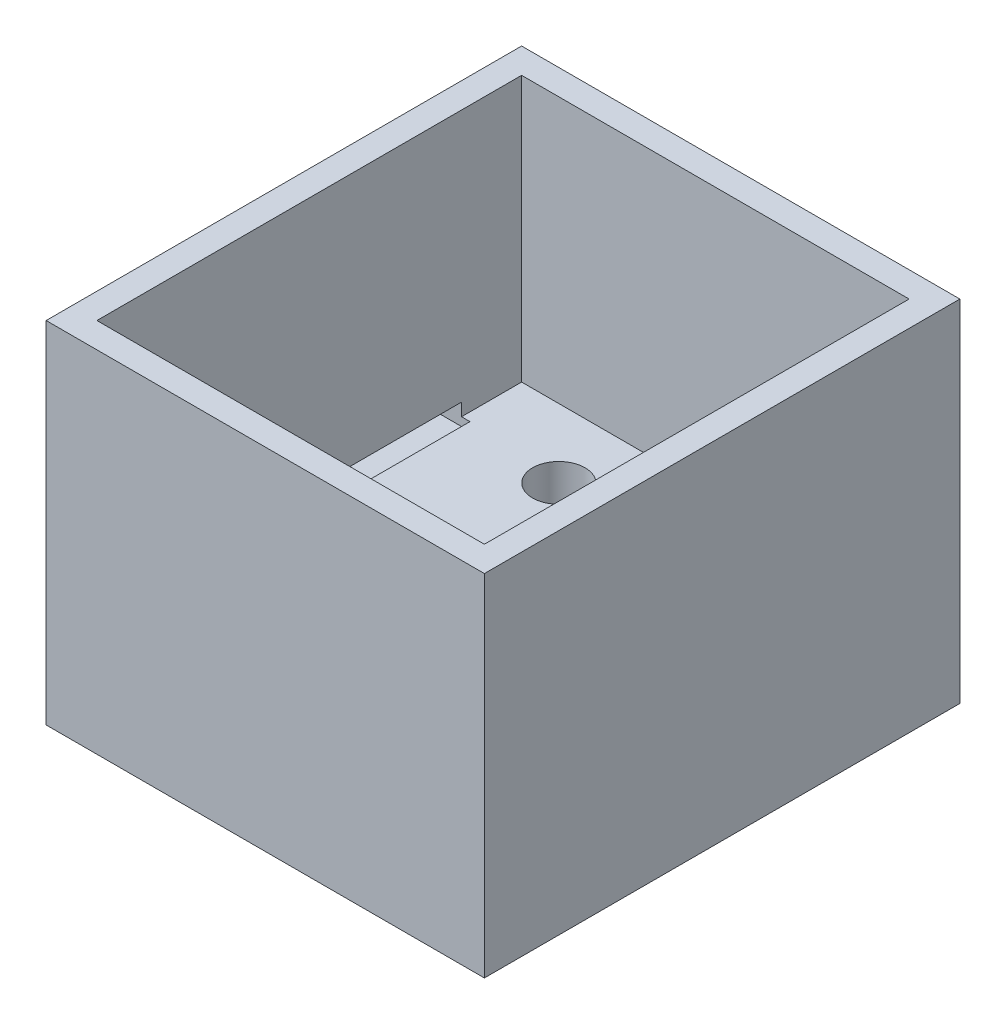
ISO-10303-21;
HEADER;
FILE_DESCRIPTION(('STEP AP214'),'2;1');
FILE_NAME('part.step','',(''),(''),'','','');
FILE_SCHEMA(('AUTOMOTIVE_DESIGN { 1 0 10303 214 1 1 1 1 }'));
ENDSEC;
DATA;
#1=APPLICATION_CONTEXT('core data for automotive mechanical design processes');
#2=APPLICATION_PROTOCOL_DEFINITION('international standard','automotive_design',2000,#1);
#3=PRODUCT_CONTEXT('',#1,'mechanical');
#4=PRODUCT('Part','Part','',(#3));
#5=PRODUCT_RELATED_PRODUCT_CATEGORY('part','',(#4));
#6=PRODUCT_DEFINITION_FORMATION('','',#4);
#7=PRODUCT_DEFINITION_CONTEXT('part definition',#1,'design');
#8=PRODUCT_DEFINITION('design','',#6,#7);
#9=PRODUCT_DEFINITION_SHAPE('','',#8);
#10=(LENGTH_UNIT() NAMED_UNIT(*) SI_UNIT(.MILLI.,.METRE.));
#11=(NAMED_UNIT(*) PLANE_ANGLE_UNIT() SI_UNIT($,.RADIAN.));
#12=(NAMED_UNIT(*) SI_UNIT($,.STERADIAN.) SOLID_ANGLE_UNIT());
#13=UNCERTAINTY_MEASURE_WITH_UNIT(LENGTH_MEASURE(1.E-05),#10,'distance_accuracy_value','');
#14=(GEOMETRIC_REPRESENTATION_CONTEXT(3) GLOBAL_UNCERTAINTY_ASSIGNED_CONTEXT((#13)) GLOBAL_UNIT_ASSIGNED_CONTEXT((#10,
#11,#12)) REPRESENTATION_CONTEXT('',''));
#15=CARTESIAN_POINT('',(0.,0.,0.));
#16=DIRECTION('',(0.,0.,1.));
#17=DIRECTION('',(1.,0.,0.));
#18=AXIS2_PLACEMENT_3D('',#15,#16,#17);
#19=CARTESIAN_POINT('',(0.,5.,0.));
#20=DIRECTION('',(0.,1.,0.));
#21=DIRECTION('',(0.,0.,1.));
#22=AXIS2_PLACEMENT_3D('',#19,#20,#21);
#23=PLANE('',#22);
#24=DIRECTION('',(-1.,0.,0.));
#25=VECTOR('',#24,1.);
#26=CARTESIAN_POINT('',(0.,5.,-20.05));
#27=LINE('',#26,#25);
#28=CARTESIAN_POINT('',(-1.,5.,-20.05));
#29=VERTEX_POINT('',#28);
#30=CARTESIAN_POINT('',(-1.5,5.,-20.05));
#31=VERTEX_POINT('',#30);
#32=EDGE_CURVE('E187',#29,#31,#27,.T.);
#33=ORIENTED_EDGE('',*,*,#32,.F.);
#34=DIRECTION('',(0.,0.,-1.));
#35=VECTOR('',#34,1.);
#36=CARTESIAN_POINT('',(-1.,5.,0.));
#37=LINE('',#36,#35);
#38=CARTESIAN_POINT('',(-1.,5.,-2.05));
#39=VERTEX_POINT('',#38);
#40=EDGE_CURVE('E11',#39,#29,#37,.T.);
#41=ORIENTED_EDGE('',*,*,#40,.F.);
#42=DIRECTION('',(1.,0.,0.));
#43=VECTOR('',#42,1.);
#44=CARTESIAN_POINT('',(0.,5.,-2.05));
#45=LINE('',#44,#43);
#46=CARTESIAN_POINT('',(-1.5,5.,-2.05));
#47=VERTEX_POINT('',#46);
#48=EDGE_CURVE('E152',#47,#39,#45,.T.);
#49=ORIENTED_EDGE('',*,*,#48,.F.);
#50=DIRECTION('',(0.,0.,1.));
#51=VECTOR('',#50,1.);
#52=CARTESIAN_POINT('',(-1.5,5.,1.5));
#53=LINE('',#52,#51);
#54=CARTESIAN_POINT('',(-1.5,5.,1.5));
#55=VERTEX_POINT('',#54);
#56=EDGE_CURVE('E190',#47,#55,#53,.T.);
#57=ORIENTED_EDGE('',*,*,#56,.T.);
#58=DIRECTION('',(1.,0.,0.));
#59=VECTOR('',#58,1.);
#60=CARTESIAN_POINT('',(21.4,5.,1.5));
#61=LINE('',#60,#59);
#62=CARTESIAN_POINT('',(21.4,5.,1.5));
#63=VERTEX_POINT('',#62);
#64=EDGE_CURVE('E210',#55,#63,#61,.T.);
#65=ORIENTED_EDGE('',*,*,#64,.T.);
#66=DIRECTION('',(0.,0.,-1.));
#67=VECTOR('',#66,1.);
#68=CARTESIAN_POINT('',(21.4,5.,-23.6));
#69=LINE('',#68,#67);
#70=CARTESIAN_POINT('',(21.4,5.,-23.6));
#71=VERTEX_POINT('',#70);
#72=EDGE_CURVE('E213',#63,#71,#69,.T.);
#73=ORIENTED_EDGE('',*,*,#72,.T.);
#74=DIRECTION('',(-1.,0.,0.));
#75=VECTOR('',#74,1.);
#76=CARTESIAN_POINT('',(-1.5,5.,-23.6));
#77=LINE('',#76,#75);
#78=CARTESIAN_POINT('',(-1.5,5.,-23.6));
#79=VERTEX_POINT('',#78);
#80=EDGE_CURVE('E195',#71,#79,#77,.T.);
#81=ORIENTED_EDGE('',*,*,#80,.T.);
#82=EDGE_CURVE('E206',#79,#31,#53,.T.);
#83=ORIENTED_EDGE('',*,*,#82,.T.);
#84=EDGE_LOOP('',(#33,#41,#49,#57,#65,#73,#81,#83));
#85=FACE_BOUND('',#84,.T.);
#86=CARTESIAN_POINT('',(17.36,5.,-2.54));
#87=DIRECTION('',(0.,1.,0.));
#88=DIRECTION('',(0.,0.,1.));
#89=AXIS2_PLACEMENT_3D('',#86,#87,#88);
#90=CIRCLE('',#89,1.55);
#91=CARTESIAN_POINT('',(17.36,5.,-0.990000000000002));
#92=VERTEX_POINT('',#91);
#93=EDGE_CURVE('E258',#92,#92,#90,.T.);
#94=ORIENTED_EDGE('',*,*,#93,.F.);
#95=EDGE_LOOP('',(#94));
#96=FACE_BOUND('',#95,.T.);
#97=CARTESIAN_POINT('',(4.76,5.,-19.54));
#98=DIRECTION('',(0.,1.,0.));
#99=DIRECTION('',(0.,0.,1.));
#100=AXIS2_PLACEMENT_3D('',#97,#98,#99);
#101=CIRCLE('',#100,1.55);
#102=CARTESIAN_POINT('',(4.76,5.,-17.99));
#103=VERTEX_POINT('',#102);
#104=EDGE_CURVE('E250',#103,#103,#101,.T.);
#105=ORIENTED_EDGE('',*,*,#104,.F.);
#106=EDGE_LOOP('',(#105));
#107=FACE_BOUND('',#106,.T.);
#108=ADVANCED_FACE('F39',(#85,#96,#107),#23,.T.);
#109=CARTESIAN_POINT('',(0.,0.,0.));
#110=DIRECTION('',(0.,1.,0.));
#111=DIRECTION('',(0.,0.,1.));
#112=AXIS2_PLACEMENT_3D('',#109,#110,#111);
#113=PLANE('',#112);
#114=DIRECTION('',(0.,0.,-1.));
#115=VECTOR('',#114,1.);
#116=CARTESIAN_POINT('',(22.9,0.,3.));
#117=LINE('',#116,#115);
#118=CARTESIAN_POINT('',(22.9,0.,3.));
#119=VERTEX_POINT('',#118);
#120=CARTESIAN_POINT('',(22.9,0.,-25.1));
#121=VERTEX_POINT('',#120);
#122=EDGE_CURVE('E262',#119,#121,#117,.T.);
#123=ORIENTED_EDGE('',*,*,#122,.F.);
#124=DIRECTION('',(1.,0.,0.));
#125=VECTOR('',#124,1.);
#126=CARTESIAN_POINT('',(-3.,0.,3.));
#127=LINE('',#126,#125);
#128=CARTESIAN_POINT('',(-3.,0.,3.));
#129=VERTEX_POINT('',#128);
#130=EDGE_CURVE('E275',#129,#119,#127,.T.);
#131=ORIENTED_EDGE('',*,*,#130,.F.);
#132=DIRECTION('',(0.,0.,1.));
#133=VECTOR('',#132,1.);
#134=CARTESIAN_POINT('',(-3.,0.,-25.1));
#135=LINE('',#134,#133);
#136=CARTESIAN_POINT('',(-3.,0.,-25.1));
#137=VERTEX_POINT('',#136);
#138=EDGE_CURVE('E272',#137,#129,#135,.T.);
#139=ORIENTED_EDGE('',*,*,#138,.F.);
#140=DIRECTION('',(-1.,0.,0.));
#141=VECTOR('',#140,1.);
#142=CARTESIAN_POINT('',(0.,0.,-25.1));
#143=LINE('',#142,#141);
#144=EDGE_CURVE('E269',#121,#137,#143,.T.);
#145=ORIENTED_EDGE('',*,*,#144,.F.);
#146=EDGE_LOOP('',(#123,#131,#139,#145));
#147=FACE_BOUND('',#146,.T.);
#148=CARTESIAN_POINT('',(17.36,0.,-2.54));
#149=DIRECTION('',(0.,1.,0.));
#150=DIRECTION('',(0.,0.,1.));
#151=AXIS2_PLACEMENT_3D('',#148,#149,#150);
#152=CIRCLE('',#151,1.55);
#153=CARTESIAN_POINT('',(17.36,0.,-0.990000000000002));
#154=VERTEX_POINT('',#153);
#155=EDGE_CURVE('E254',#154,#154,#152,.T.);
#156=ORIENTED_EDGE('',*,*,#155,.T.);
#157=EDGE_LOOP('',(#156));
#158=FACE_BOUND('',#157,.T.);
#159=CARTESIAN_POINT('',(4.76,0.,-19.54));
#160=DIRECTION('',(0.,1.,0.));
#161=DIRECTION('',(0.,0.,1.));
#162=AXIS2_PLACEMENT_3D('',#159,#160,#161);
#163=CIRCLE('',#162,1.55);
#164=CARTESIAN_POINT('',(4.76,0.,-17.99));
#165=VERTEX_POINT('',#164);
#166=EDGE_CURVE('E249',#165,#165,#163,.T.);
#167=ORIENTED_EDGE('',*,*,#166,.T.);
#168=EDGE_LOOP('',(#167));
#169=FACE_BOUND('',#168,.T.);
#170=ADVANCED_FACE('F332',(#147,#158,#169),#113,.F.);
#171=CARTESIAN_POINT('',(22.9,5.,3.));
#172=DIRECTION('',(-1.,0.,0.));
#173=DIRECTION('',(0.,0.,1.));
#174=AXIS2_PLACEMENT_3D('',#171,#172,#173);
#175=PLANE('',#174);
#176=ORIENTED_EDGE('',*,*,#122,.T.);
#177=DIRECTION('',(0.,-1.,0.));
#178=VECTOR('',#177,1.);
#179=CARTESIAN_POINT('',(22.9,5.,-25.1));
#180=LINE('',#179,#178);
#181=CARTESIAN_POINT('',(22.9,20.7,-25.1));
#182=VERTEX_POINT('',#181);
#183=EDGE_CURVE('E290',#182,#121,#180,.T.);
#184=ORIENTED_EDGE('',*,*,#183,.F.);
#185=DIRECTION('',(0.,0.,-1.));
#186=VECTOR('',#185,1.);
#187=CARTESIAN_POINT('',(22.9,20.7,3.));
#188=LINE('',#187,#186);
#189=CARTESIAN_POINT('',(22.9,20.7,3.));
#190=VERTEX_POINT('',#189);
#191=EDGE_CURVE('E245',#190,#182,#188,.T.);
#192=ORIENTED_EDGE('',*,*,#191,.F.);
#193=DIRECTION('',(0.,-1.,0.));
#194=VECTOR('',#193,1.);
#195=CARTESIAN_POINT('',(22.9,5.,3.));
#196=LINE('',#195,#194);
#197=EDGE_CURVE('E278',#190,#119,#196,.T.);
#198=ORIENTED_EDGE('',*,*,#197,.T.);
#199=EDGE_LOOP('',(#176,#184,#192,#198));
#200=FACE_BOUND('',#199,.T.);
#201=ADVANCED_FACE('F41',(#200),#175,.F.);
#202=CARTESIAN_POINT('',(0.,5.,-25.1));
#203=DIRECTION('',(0.,0.,1.));
#204=DIRECTION('',(1.,0.,0.));
#205=AXIS2_PLACEMENT_3D('',#202,#203,#204);
#206=PLANE('',#205);
#207=ORIENTED_EDGE('',*,*,#144,.T.);
#208=DIRECTION('',(0.,-1.,0.));
#209=VECTOR('',#208,1.);
#210=CARTESIAN_POINT('',(-3.,5.,-25.1));
#211=LINE('',#210,#209);
#212=CARTESIAN_POINT('',(-3.,20.7,-25.1));
#213=VERTEX_POINT('',#212);
#214=EDGE_CURVE('E286',#213,#137,#211,.T.);
#215=ORIENTED_EDGE('',*,*,#214,.F.);
#216=DIRECTION('',(-1.,0.,0.));
#217=VECTOR('',#216,1.);
#218=CARTESIAN_POINT('',(22.9,20.7,-25.1));
#219=LINE('',#218,#217);
#220=EDGE_CURVE('E233',#182,#213,#219,.T.);
#221=ORIENTED_EDGE('',*,*,#220,.F.);
#222=ORIENTED_EDGE('',*,*,#183,.T.);
#223=EDGE_LOOP('',(#207,#215,#221,#222));
#224=FACE_BOUND('',#223,.T.);
#225=ADVANCED_FACE('F323',(#224),#206,.F.);
#226=CARTESIAN_POINT('',(-3.,5.,-25.1));
#227=DIRECTION('',(1.,0.,0.));
#228=DIRECTION('',(0.,0.,-1.));
#229=AXIS2_PLACEMENT_3D('',#226,#227,#228);
#230=PLANE('',#229);
#231=DIRECTION('',(0.,1.,0.));
#232=VECTOR('',#231,1.);
#233=CARTESIAN_POINT('',(-3.,5.75,-2.05));
#234=LINE('',#233,#232);
#235=CARTESIAN_POINT('',(-3.,4.5,-2.05));
#236=VERTEX_POINT('',#235);
#237=CARTESIAN_POINT('',(-3.,5.75,-2.05));
#238=VERTEX_POINT('',#237);
#239=EDGE_CURVE('E167',#236,#238,#234,.T.);
#240=ORIENTED_EDGE('',*,*,#239,.F.);
#241=DIRECTION('',(0.,0.,1.));
#242=VECTOR('',#241,1.);
#243=CARTESIAN_POINT('',(-3.,4.5,-11.05));
#244=LINE('',#243,#242);
#245=CARTESIAN_POINT('',(-3.,4.5,-20.05));
#246=VERTEX_POINT('',#245);
#247=EDGE_CURVE('E143',#246,#236,#244,.T.);
#248=ORIENTED_EDGE('',*,*,#247,.F.);
#249=DIRECTION('',(0.,-1.,0.));
#250=VECTOR('',#249,1.);
#251=CARTESIAN_POINT('',(-3.,4.5,-20.05));
#252=LINE('',#251,#250);
#253=CARTESIAN_POINT('',(-3.,5.75,-20.05));
#254=VERTEX_POINT('',#253);
#255=EDGE_CURVE('E162',#254,#246,#252,.T.);
#256=ORIENTED_EDGE('',*,*,#255,.F.);
#257=DIRECTION('',(0.,0.,-1.));
#258=VECTOR('',#257,1.);
#259=CARTESIAN_POINT('',(-3.,5.75,-20.05));
#260=LINE('',#259,#258);
#261=EDGE_CURVE('E170',#238,#254,#260,.T.);
#262=ORIENTED_EDGE('',*,*,#261,.F.);
#263=EDGE_LOOP('',(#240,#248,#256,#262));
#264=FACE_BOUND('',#263,.T.);
#265=ORIENTED_EDGE('',*,*,#138,.T.);
#266=DIRECTION('',(0.,-1.,0.));
#267=VECTOR('',#266,1.);
#268=CARTESIAN_POINT('',(-3.,5.,3.));
#269=LINE('',#268,#267);
#270=CARTESIAN_POINT('',(-3.,20.7,3.));
#271=VERTEX_POINT('',#270);
#272=EDGE_CURVE('E282',#271,#129,#269,.T.);
#273=ORIENTED_EDGE('',*,*,#272,.F.);
#274=DIRECTION('',(0.,0.,1.));
#275=VECTOR('',#274,1.);
#276=CARTESIAN_POINT('',(-3.,20.7,-25.1));
#277=LINE('',#276,#275);
#278=EDGE_CURVE('E237',#213,#271,#277,.T.);
#279=ORIENTED_EDGE('',*,*,#278,.F.);
#280=ORIENTED_EDGE('',*,*,#214,.T.);
#281=EDGE_LOOP('',(#265,#273,#279,#280));
#282=FACE_BOUND('',#281,.T.);
#283=ADVANCED_FACE('F319',(#264,#282),#230,.F.);
#284=CARTESIAN_POINT('',(-3.,5.,3.));
#285=DIRECTION('',(0.,0.,-1.));
#286=DIRECTION('',(-1.,0.,0.));
#287=AXIS2_PLACEMENT_3D('',#284,#285,#286);
#288=PLANE('',#287);
#289=ORIENTED_EDGE('',*,*,#130,.T.);
#290=ORIENTED_EDGE('',*,*,#197,.F.);
#291=DIRECTION('',(1.,0.,0.));
#292=VECTOR('',#291,1.);
#293=CARTESIAN_POINT('',(-3.,20.7,3.));
#294=LINE('',#293,#292);
#295=EDGE_CURVE('E241',#271,#190,#294,.T.);
#296=ORIENTED_EDGE('',*,*,#295,.F.);
#297=ORIENTED_EDGE('',*,*,#272,.T.);
#298=EDGE_LOOP('',(#289,#290,#296,#297));
#299=FACE_BOUND('',#298,.T.);
#300=ADVANCED_FACE('F322',(#299),#288,.F.);
#301=CARTESIAN_POINT('',(17.36,5.,-2.54));
#302=DIRECTION('',(0.,-1.,0.));
#303=DIRECTION('',(0.,0.,-1.));
#304=AXIS2_PLACEMENT_3D('',#301,#302,#303);
#305=CYLINDRICAL_SURFACE('',#304,1.55);
#306=ORIENTED_EDGE('',*,*,#93,.T.);
#307=EDGE_LOOP('',(#306));
#308=FACE_BOUND('',#307,.T.);
#309=ORIENTED_EDGE('',*,*,#155,.F.);
#310=EDGE_LOOP('',(#309));
#311=FACE_BOUND('',#310,.T.);
#312=ADVANCED_FACE('F352',(#308,#311),#305,.F.);
#313=CARTESIAN_POINT('',(4.76,5.,-19.54));
#314=DIRECTION('',(0.,-1.,0.));
#315=DIRECTION('',(0.,0.,-1.));
#316=AXIS2_PLACEMENT_3D('',#313,#314,#315);
#317=CYLINDRICAL_SURFACE('',#316,1.55);
#318=ORIENTED_EDGE('',*,*,#104,.T.);
#319=EDGE_LOOP('',(#318));
#320=FACE_BOUND('',#319,.T.);
#321=ORIENTED_EDGE('',*,*,#166,.F.);
#322=EDGE_LOOP('',(#321));
#323=FACE_BOUND('',#322,.T.);
#324=ADVANCED_FACE('F359',(#320,#323),#317,.F.);
#325=CARTESIAN_POINT('',(0.,20.7,0.));
#326=DIRECTION('',(0.,1.,0.));
#327=DIRECTION('',(0.,0.,1.));
#328=AXIS2_PLACEMENT_3D('',#325,#326,#327);
#329=PLANE('',#328);
#330=ORIENTED_EDGE('',*,*,#220,.T.);
#331=ORIENTED_EDGE('',*,*,#278,.T.);
#332=ORIENTED_EDGE('',*,*,#295,.T.);
#333=ORIENTED_EDGE('',*,*,#191,.T.);
#334=EDGE_LOOP('',(#330,#331,#332,#333));
#335=FACE_BOUND('',#334,.T.);
#336=DIRECTION('',(1.,0.,0.));
#337=VECTOR('',#336,1.);
#338=CARTESIAN_POINT('',(21.4,20.7,1.5));
#339=LINE('',#338,#337);
#340=CARTESIAN_POINT('',(-1.5,20.7,1.5));
#341=VERTEX_POINT('',#340);
#342=CARTESIAN_POINT('',(21.4,20.7,1.5));
#343=VERTEX_POINT('',#342);
#344=EDGE_CURVE('E194',#341,#343,#339,.T.);
#345=ORIENTED_EDGE('',*,*,#344,.F.);
#346=DIRECTION('',(0.,0.,1.));
#347=VECTOR('',#346,1.);
#348=CARTESIAN_POINT('',(-1.5,20.7,1.5));
#349=LINE('',#348,#347);
#350=CARTESIAN_POINT('',(-1.5,20.7,-23.6));
#351=VERTEX_POINT('',#350);
#352=EDGE_CURVE('E191',#351,#341,#349,.T.);
#353=ORIENTED_EDGE('',*,*,#352,.F.);
#354=DIRECTION('',(-1.,0.,0.));
#355=VECTOR('',#354,1.);
#356=CARTESIAN_POINT('',(-1.5,20.7,-23.6));
#357=LINE('',#356,#355);
#358=CARTESIAN_POINT('',(21.4,20.7,-23.6));
#359=VERTEX_POINT('',#358);
#360=EDGE_CURVE('E202',#359,#351,#357,.T.);
#361=ORIENTED_EDGE('',*,*,#360,.F.);
#362=DIRECTION('',(0.,0.,-1.));
#363=VECTOR('',#362,1.);
#364=CARTESIAN_POINT('',(21.4,20.7,-23.6));
#365=LINE('',#364,#363);
#366=EDGE_CURVE('E198',#343,#359,#365,.T.);
#367=ORIENTED_EDGE('',*,*,#366,.F.);
#368=EDGE_LOOP('',(#345,#353,#361,#367));
#369=FACE_BOUND('',#368,.T.);
#370=ADVANCED_FACE('F337',(#335,#369),#329,.T.);
#371=CARTESIAN_POINT('',(-1.5,20.7,1.5));
#372=DIRECTION('',(1.,0.,0.));
#373=DIRECTION('',(0.,0.,-1.));
#374=AXIS2_PLACEMENT_3D('',#371,#372,#373);
#375=PLANE('',#374);
#376=DIRECTION('',(0.,1.,0.));
#377=VECTOR('',#376,1.);
#378=CARTESIAN_POINT('',(-1.5,20.7,-20.05));
#379=LINE('',#378,#377);
#380=CARTESIAN_POINT('',(-1.5,5.75,-20.05));
#381=VERTEX_POINT('',#380);
#382=EDGE_CURVE('E48',#31,#381,#379,.T.);
#383=ORIENTED_EDGE('',*,*,#382,.F.);
#384=ORIENTED_EDGE('',*,*,#82,.F.);
#385=DIRECTION('',(0.,-1.,0.));
#386=VECTOR('',#385,1.);
#387=CARTESIAN_POINT('',(-1.5,20.7,-23.6));
#388=LINE('',#387,#386);
#389=EDGE_CURVE('E205',#351,#79,#388,.T.);
#390=ORIENTED_EDGE('',*,*,#389,.F.);
#391=ORIENTED_EDGE('',*,*,#352,.T.);
#392=DIRECTION('',(0.,-1.,0.));
#393=VECTOR('',#392,1.);
#394=CARTESIAN_POINT('',(-1.5,20.7,1.5));
#395=LINE('',#394,#393);
#396=EDGE_CURVE('E229',#341,#55,#395,.T.);
#397=ORIENTED_EDGE('',*,*,#396,.T.);
#398=ORIENTED_EDGE('',*,*,#56,.F.);
#399=DIRECTION('',(0.,-1.,0.));
#400=VECTOR('',#399,1.);
#401=CARTESIAN_POINT('',(-1.5,20.7,-2.05));
#402=LINE('',#401,#400);
#403=CARTESIAN_POINT('',(-1.5,5.75,-2.05));
#404=VERTEX_POINT('',#403);
#405=EDGE_CURVE('E294',#404,#47,#402,.T.);
#406=ORIENTED_EDGE('',*,*,#405,.F.);
#407=DIRECTION('',(0.,0.,1.));
#408=VECTOR('',#407,1.);
#409=CARTESIAN_POINT('',(-1.5,5.75,1.5));
#410=LINE('',#409,#408);
#411=EDGE_CURVE('E297',#381,#404,#410,.T.);
#412=ORIENTED_EDGE('',*,*,#411,.F.);
#413=EDGE_LOOP('',(#383,#384,#390,#391,#397,#398,#406,#412));
#414=FACE_BOUND('',#413,.T.);
#415=ADVANCED_FACE('F313',(#414),#375,.T.);
#416=CARTESIAN_POINT('',(21.4,20.7,1.5));
#417=DIRECTION('',(0.,0.,-1.));
#418=DIRECTION('',(-1.,0.,0.));
#419=AXIS2_PLACEMENT_3D('',#416,#417,#418);
#420=PLANE('',#419);
#421=ORIENTED_EDGE('',*,*,#64,.F.);
#422=ORIENTED_EDGE('',*,*,#396,.F.);
#423=ORIENTED_EDGE('',*,*,#344,.T.);
#424=DIRECTION('',(0.,-1.,0.));
#425=VECTOR('',#424,1.);
#426=CARTESIAN_POINT('',(21.4,20.7,1.5));
#427=LINE('',#426,#425);
#428=EDGE_CURVE('E225',#343,#63,#427,.T.);
#429=ORIENTED_EDGE('',*,*,#428,.T.);
#430=EDGE_LOOP('',(#421,#422,#423,#429));
#431=FACE_BOUND('',#430,.T.);
#432=ADVANCED_FACE('F380',(#431),#420,.T.);
#433=CARTESIAN_POINT('',(21.4,20.7,-23.6));
#434=DIRECTION('',(-1.,0.,0.));
#435=DIRECTION('',(0.,0.,1.));
#436=AXIS2_PLACEMENT_3D('',#433,#434,#435);
#437=PLANE('',#436);
#438=ORIENTED_EDGE('',*,*,#72,.F.);
#439=ORIENTED_EDGE('',*,*,#428,.F.);
#440=ORIENTED_EDGE('',*,*,#366,.T.);
#441=DIRECTION('',(0.,-1.,0.));
#442=VECTOR('',#441,1.);
#443=CARTESIAN_POINT('',(21.4,20.7,-23.6));
#444=LINE('',#443,#442);
#445=EDGE_CURVE('E221',#359,#71,#444,.T.);
#446=ORIENTED_EDGE('',*,*,#445,.T.);
#447=EDGE_LOOP('',(#438,#439,#440,#446));
#448=FACE_BOUND('',#447,.T.);
#449=ADVANCED_FACE('F383',(#448),#437,.T.);
#450=CARTESIAN_POINT('',(-1.5,20.7,-23.6));
#451=DIRECTION('',(0.,0.,1.));
#452=DIRECTION('',(1.,0.,0.));
#453=AXIS2_PLACEMENT_3D('',#450,#451,#452);
#454=PLANE('',#453);
#455=ORIENTED_EDGE('',*,*,#80,.F.);
#456=ORIENTED_EDGE('',*,*,#445,.F.);
#457=ORIENTED_EDGE('',*,*,#360,.T.);
#458=ORIENTED_EDGE('',*,*,#389,.T.);
#459=EDGE_LOOP('',(#455,#456,#457,#458));
#460=FACE_BOUND('',#459,.T.);
#461=ADVANCED_FACE('F387',(#460),#454,.T.);
#462=CARTESIAN_POINT('',(-1.,4.5,-11.05));
#463=DIRECTION('',(0.,-1.,0.));
#464=DIRECTION('',(0.,0.,-1.));
#465=AXIS2_PLACEMENT_3D('',#462,#463,#464);
#466=PLANE('',#465);
#467=ORIENTED_EDGE('',*,*,#247,.T.);
#468=DIRECTION('',(-1.,0.,0.));
#469=VECTOR('',#468,1.);
#470=CARTESIAN_POINT('',(-1.,4.5,-2.05));
#471=LINE('',#470,#469);
#472=CARTESIAN_POINT('',(-1.,4.5,-2.05));
#473=VERTEX_POINT('',#472);
#474=EDGE_CURVE('E55',#473,#236,#471,.T.);
#475=ORIENTED_EDGE('',*,*,#474,.F.);
#476=DIRECTION('',(0.,0.,1.));
#477=VECTOR('',#476,1.);
#478=CARTESIAN_POINT('',(-1.,4.5,-11.05));
#479=LINE('',#478,#477);
#480=CARTESIAN_POINT('',(-1.,4.5,-20.05));
#481=VERTEX_POINT('',#480);
#482=EDGE_CURVE('E140',#481,#473,#479,.T.);
#483=ORIENTED_EDGE('',*,*,#482,.F.);
#484=DIRECTION('',(-1.,0.,0.));
#485=VECTOR('',#484,1.);
#486=CARTESIAN_POINT('',(-1.,4.5,-20.05));
#487=LINE('',#486,#485);
#488=EDGE_CURVE('E177',#481,#246,#487,.T.);
#489=ORIENTED_EDGE('',*,*,#488,.T.);
#490=EDGE_LOOP('',(#467,#475,#483,#489));
#491=FACE_BOUND('',#490,.T.);
#492=ADVANCED_FACE('F138',(#491),#466,.F.);
#493=CARTESIAN_POINT('',(-1.,4.5,-20.05));
#494=DIRECTION('',(0.,0.,-1.));
#495=DIRECTION('',(-1.,0.,0.));
#496=AXIS2_PLACEMENT_3D('',#493,#494,#495);
#497=PLANE('',#496);
#498=ORIENTED_EDGE('',*,*,#32,.T.);
#499=ORIENTED_EDGE('',*,*,#382,.T.);
#500=DIRECTION('',(-1.,0.,0.));
#501=VECTOR('',#500,1.);
#502=CARTESIAN_POINT('',(-1.,5.75,-20.05));
#503=LINE('',#502,#501);
#504=EDGE_CURVE('E180',#381,#254,#503,.T.);
#505=ORIENTED_EDGE('',*,*,#504,.T.);
#506=ORIENTED_EDGE('',*,*,#255,.T.);
#507=ORIENTED_EDGE('',*,*,#488,.F.);
#508=DIRECTION('',(0.,-1.,0.));
#509=VECTOR('',#508,1.);
#510=CARTESIAN_POINT('',(-1.,4.5,-20.05));
#511=LINE('',#510,#509);
#512=EDGE_CURVE('E146',#29,#481,#511,.T.);
#513=ORIENTED_EDGE('',*,*,#512,.F.);
#514=EDGE_LOOP('',(#498,#499,#505,#506,#507,#513));
#515=FACE_BOUND('',#514,.T.);
#516=ADVANCED_FACE('F303',(#515),#497,.F.);
#517=CARTESIAN_POINT('',(-1.,5.75,-20.05));
#518=DIRECTION('',(0.,1.,0.));
#519=DIRECTION('',(0.,0.,1.));
#520=AXIS2_PLACEMENT_3D('',#517,#518,#519);
#521=PLANE('',#520);
#522=ORIENTED_EDGE('',*,*,#411,.T.);
#523=DIRECTION('',(-1.,0.,0.));
#524=VECTOR('',#523,1.);
#525=CARTESIAN_POINT('',(-1.,5.75,-2.05));
#526=LINE('',#525,#524);
#527=EDGE_CURVE('E61',#404,#238,#526,.T.);
#528=ORIENTED_EDGE('',*,*,#527,.T.);
#529=ORIENTED_EDGE('',*,*,#261,.T.);
#530=ORIENTED_EDGE('',*,*,#504,.F.);
#531=EDGE_LOOP('',(#522,#528,#529,#530));
#532=FACE_BOUND('',#531,.T.);
#533=ADVANCED_FACE('F309',(#532),#521,.F.);
#534=CARTESIAN_POINT('',(-1.,5.75,-2.05));
#535=DIRECTION('',(0.,0.,1.));
#536=DIRECTION('',(1.,0.,0.));
#537=AXIS2_PLACEMENT_3D('',#534,#535,#536);
#538=PLANE('',#537);
#539=ORIENTED_EDGE('',*,*,#48,.T.);
#540=DIRECTION('',(0.,1.,0.));
#541=VECTOR('',#540,1.);
#542=CARTESIAN_POINT('',(-1.,5.75,-2.05));
#543=LINE('',#542,#541);
#544=EDGE_CURVE('E149',#473,#39,#543,.T.);
#545=ORIENTED_EDGE('',*,*,#544,.F.);
#546=ORIENTED_EDGE('',*,*,#474,.T.);
#547=ORIENTED_EDGE('',*,*,#239,.T.);
#548=ORIENTED_EDGE('',*,*,#527,.F.);
#549=ORIENTED_EDGE('',*,*,#405,.T.);
#550=EDGE_LOOP('',(#539,#545,#546,#547,#548,#549));
#551=FACE_BOUND('',#550,.T.);
#552=ADVANCED_FACE('F150',(#551),#538,.F.);
#553=CARTESIAN_POINT('',(-1.,0.,0.));
#554=DIRECTION('',(1.,0.,0.));
#555=DIRECTION('',(0.,0.,-1.));
#556=AXIS2_PLACEMENT_3D('',#553,#554,#555);
#557=PLANE('',#556);
#558=ORIENTED_EDGE('',*,*,#40,.T.);
#559=ORIENTED_EDGE('',*,*,#512,.T.);
#560=ORIENTED_EDGE('',*,*,#482,.T.);
#561=ORIENTED_EDGE('',*,*,#544,.T.);
#562=EDGE_LOOP('',(#558,#559,#560,#561));
#563=FACE_BOUND('',#562,.T.);
#564=ADVANCED_FACE('F157',(#563),#557,.F.);
#565=CLOSED_SHELL('',(#108,#170,#201,#225,#283,#300,#312,#324,#370,#415,#432,#449,#461,#492,
#516,#533,#552,#564));
#566=MANIFOLD_SOLID_BREP('B2',#565);
#567=ADVANCED_BREP_SHAPE_REPRESENTATION('',(#18,#566),#14);
#568=SHAPE_DEFINITION_REPRESENTATION(#9,#567);
ENDSEC;
END-ISO-10303-21;
